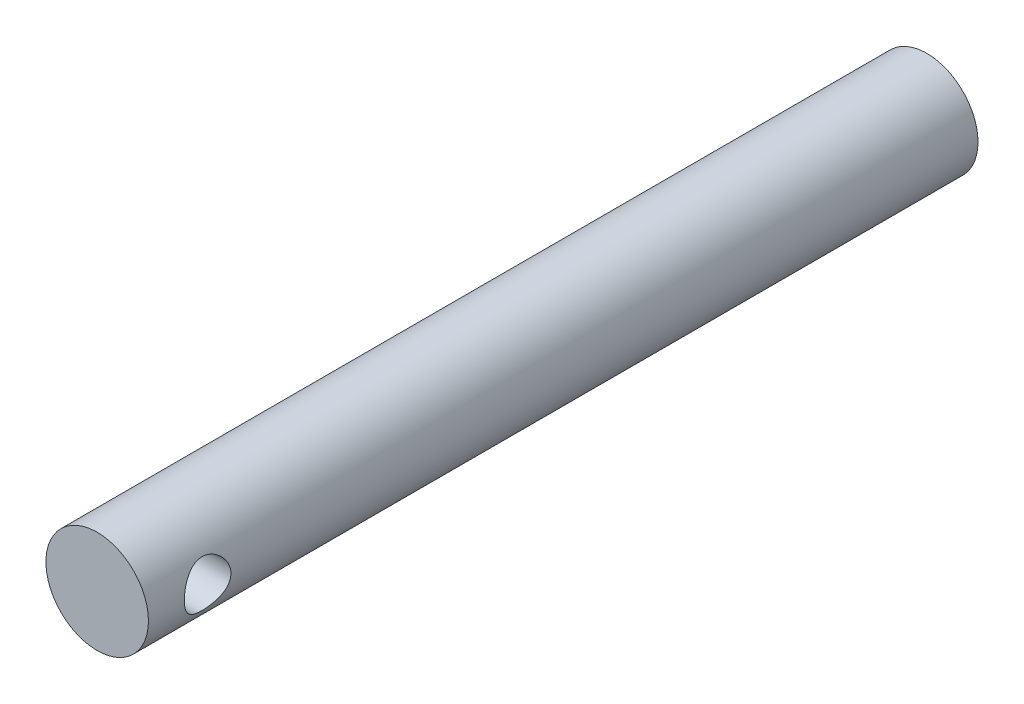
ISO-10303-21;
HEADER;
FILE_DESCRIPTION(('STEP AP214'),'2;1');
FILE_NAME('part.step','',(''),(''),'','','');
FILE_SCHEMA(('AUTOMOTIVE_DESIGN { 1 0 10303 214 1 1 1 1 }'));
ENDSEC;
DATA;
#1=APPLICATION_CONTEXT('core data for automotive mechanical design processes');
#2=APPLICATION_PROTOCOL_DEFINITION('international standard','automotive_design',2000,#1);
#3=PRODUCT_CONTEXT('',#1,'mechanical');
#4=PRODUCT('Part','Part','',(#3));
#5=PRODUCT_RELATED_PRODUCT_CATEGORY('part','',(#4));
#6=PRODUCT_DEFINITION_FORMATION('','',#4);
#7=PRODUCT_DEFINITION_CONTEXT('part definition',#1,'design');
#8=PRODUCT_DEFINITION('design','',#6,#7);
#9=PRODUCT_DEFINITION_SHAPE('','',#8);
#10=(LENGTH_UNIT() NAMED_UNIT(*) SI_UNIT(.MILLI.,.METRE.));
#11=(NAMED_UNIT(*) PLANE_ANGLE_UNIT() SI_UNIT($,.RADIAN.));
#12=(NAMED_UNIT(*) SI_UNIT($,.STERADIAN.) SOLID_ANGLE_UNIT());
#13=UNCERTAINTY_MEASURE_WITH_UNIT(LENGTH_MEASURE(1.E-05),#10,'distance_accuracy_value','');
#14=(GEOMETRIC_REPRESENTATION_CONTEXT(3) GLOBAL_UNCERTAINTY_ASSIGNED_CONTEXT((#13)) GLOBAL_UNIT_ASSIGNED_CONTEXT((#10,
#11,#12)) REPRESENTATION_CONTEXT('',''));
#15=CARTESIAN_POINT('',(0.,0.,0.));
#16=DIRECTION('',(0.,0.,1.));
#17=DIRECTION('',(1.,0.,0.));
#18=AXIS2_PLACEMENT_3D('',#15,#16,#17);
#19=CARTESIAN_POINT('',(0.,0.,-89.));
#20=DIRECTION('',(0.,0.,-1.));
#21=DIRECTION('',(-1.,0.,0.));
#22=AXIS2_PLACEMENT_3D('',#19,#20,#21);
#23=PLANE('',#22);
#24=CARTESIAN_POINT('',(0.,0.,-89.));
#25=DIRECTION('',(0.,0.,-1.));
#26=DIRECTION('',(-1.,0.,0.));
#27=AXIS2_PLACEMENT_3D('',#24,#25,#26);
#28=CIRCLE('',#27,2.44549999999999);
#29=CARTESIAN_POINT('',(-2.44549999999999,0.,-89.));
#30=VERTEX_POINT('',#29);
#31=EDGE_CURVE('E62',#30,#30,#28,.T.);
#32=ORIENTED_EDGE('',*,*,#31,.F.);
#33=EDGE_LOOP('',(#32));
#34=FACE_BOUND('',#33,.T.);
#35=CARTESIAN_POINT('',(0.,0.,-89.));
#36=DIRECTION('',(0.,0.,1.));
#37=DIRECTION('',(1.,0.,0.));
#38=AXIS2_PLACEMENT_3D('',#35,#36,#37);
#39=CIRCLE('',#38,5.5);
#40=CARTESIAN_POINT('',(5.5,0.,-89.));
#41=VERTEX_POINT('',#40);
#42=EDGE_CURVE('E11',#41,#41,#39,.T.);
#43=ORIENTED_EDGE('',*,*,#42,.F.);
#44=EDGE_LOOP('',(#43));
#45=FACE_BOUND('',#44,.T.);
#46=ADVANCED_FACE('F37',(#34,#45),#23,.T.);
#47=CARTESIAN_POINT('',(0.,0.,0.));
#48=DIRECTION('',(0.,0.,1.));
#49=DIRECTION('',(1.,0.,0.));
#50=AXIS2_PLACEMENT_3D('',#47,#48,#49);
#51=CYLINDRICAL_SURFACE('',#50,5.5);
#52=CARTESIAN_POINT('',(5.5,0.,-8.85));
#53=CARTESIAN_POINT('',(5.49999369870931,0.132816145284357,-8.84999229342032));
#54=CARTESIAN_POINT('',(5.49513526114601,0.265835701448803,-8.83935291148528));
#55=CARTESIAN_POINT('',(5.47618102046917,0.528027896062537,-8.79722291414957));
#56=CARTESIAN_POINT('',(5.46206378775658,0.657190881556424,-8.76568392457899));
#57=CARTESIAN_POINT('',(5.42608787981103,0.907466739557299,-8.68319455284778));
#58=CARTESIAN_POINT('',(5.40425732698846,1.02860698228922,-8.63231463636596));
#59=CARTESIAN_POINT('',(5.35492606344154,1.26049169700434,-8.51291058064466));
#60=CARTESIAN_POINT('',(5.32742648991282,1.37123824747009,-8.44438997941068));
#61=CARTESIAN_POINT('',(5.26767788661504,1.58575279564469,-8.28751407526684));
#62=CARTESIAN_POINT('',(5.23525516065229,1.68884771841108,-8.19830532239209));
#63=CARTESIAN_POINT('',(5.169981608249,1.87921167122033,-8.00440108987697));
#64=CARTESIAN_POINT('',(5.1371305283963,1.96647083094001,-7.89969602479297));
#65=CARTESIAN_POINT('',(5.07244492450594,2.12798843737884,-7.6700550578719));
#66=CARTESIAN_POINT('',(5.040794979573,2.20112759491811,-7.54427419294911));
#67=CARTESIAN_POINT('',(4.98491966737432,2.32491325493927,-7.28056798081201));
#68=CARTESIAN_POINT('',(4.96068978306032,2.37557345021863,-7.14265008825662));
#69=CARTESIAN_POINT('',(4.9243140427224,2.45005627758752,-6.86630451436695));
#70=CARTESIAN_POINT('',(4.91158514421169,2.47518302941619,-6.72830841926503));
#71=CARTESIAN_POINT('',(4.89801821463239,2.50193279260797,-6.44951805458402));
#72=CARTESIAN_POINT('',(4.89717166555205,2.50357264087074,-6.30872586193638));
#73=CARTESIAN_POINT('',(4.90698153027191,2.48427141198996,-6.04258927973666));
#74=CARTESIAN_POINT('',(4.91655818122591,2.46545016283118,-5.91704267044116));
#75=CARTESIAN_POINT('',(4.94428109958009,2.4093676508794,-5.6711339234907));
#76=CARTESIAN_POINT('',(4.96242941226084,2.37210198697065,-5.55077303068094));
#77=CARTESIAN_POINT('',(5.00567208218791,2.27945184779561,-5.31536342011179));
#78=CARTESIAN_POINT('',(5.03091516285485,2.22367420519436,-5.20049801398919));
#79=CARTESIAN_POINT('',(5.08548488907163,2.09586859273949,-4.9812585447318));
#80=CARTESIAN_POINT('',(5.11481328424216,2.02383365211919,-4.87688900982492));
#81=CARTESIAN_POINT('',(5.17789221587211,1.85692478057703,-4.67035343477603));
#82=CARTESIAN_POINT('',(5.2117880598316,1.76046753299936,-4.56950726646535));
#83=CARTESIAN_POINT('',(5.27769368397502,1.55174815249175,-4.38493172671319));
#84=CARTESIAN_POINT('',(5.30970283886444,1.43948082103431,-4.30120800761349));
#85=CARTESIAN_POINT('',(5.36950534618767,1.19766281925566,-4.15079331604037));
#86=CARTESIAN_POINT('',(5.39712978524095,1.06767206685173,-4.08473752097628));
#87=CARTESIAN_POINT('',(5.44369936052484,0.796844896081458,-3.97591160412101));
#88=CARTESIAN_POINT('',(5.46265022004357,0.656015701378205,-3.93312612382021));
#89=CARTESIAN_POINT('',(5.48860490400603,0.378449914355491,-3.87504463063654));
#90=CARTESIAN_POINT('',(5.49637394767751,0.242154484202897,-3.85798360079138));
#91=CARTESIAN_POINT('',(5.50161007334277,-0.0315660436282497,-3.84645311553908));
#92=CARTESIAN_POINT('',(5.49908087348691,-0.168990715716222,-3.85197550645783));
#93=CARTESIAN_POINT('',(5.48448407938737,-0.432146778493068,-3.8842858090429));
#94=CARTESIAN_POINT('',(5.47301153257062,-0.558078127396234,-3.90974752153944));
#95=CARTESIAN_POINT('',(5.44237110560927,-0.803693463481534,-3.97926732612561));
#96=CARTESIAN_POINT('',(5.42320230560714,-0.923376701955516,-4.02332764115579));
#97=CARTESIAN_POINT('',(5.37821815950354,-1.15732747516372,-4.13016974808212));
#98=CARTESIAN_POINT('',(5.35221506502489,-1.27131180951637,-4.19348993487643));
#99=CARTESIAN_POINT('',(5.29622400098564,-1.48744614928835,-4.336467554666));
#100=CARTESIAN_POINT('',(5.26623428600456,-1.58959093424205,-4.41613215191308));
#101=CARTESIAN_POINT('',(5.2023213866395,-1.78819128612951,-4.59731065312498));
#102=CARTESIAN_POINT('',(5.16827928194194,-1.88345063650186,-4.70009689074964));
#103=CARTESIAN_POINT('',(5.10218027178943,-2.05579555974773,-4.92056236624014));
#104=CARTESIAN_POINT('',(5.0701241805496,-2.13287371467411,-5.03824765294476));
#105=CARTESIAN_POINT('',(5.01093675854132,-2.26851417742739,-5.28945416883373));
#106=CARTESIAN_POINT('',(4.98396428661225,-2.32651178086012,-5.42332074420197));
#107=CARTESIAN_POINT('',(4.93995555801825,-2.41857144488097,-5.7005494134242));
#108=CARTESIAN_POINT('',(4.9229090037493,-2.45265831910444,-5.84390149396125));
#109=CARTESIAN_POINT('',(4.90246200756536,-2.49325807507769,-6.1225626196746));
#110=CARTESIAN_POINT('',(4.89799994349808,-2.5019188531559,-6.25748092260223));
#111=CARTESIAN_POINT('',(4.90032179261342,-2.49737021161822,-6.52683309147012));
#112=CARTESIAN_POINT('',(4.90710299172004,-2.48416607010204,-6.66126706647474));
#113=CARTESIAN_POINT('',(4.93010341873286,-2.4381684933062,-6.91662629613718));
#114=CARTESIAN_POINT('',(4.94567287009983,-2.40671995185148,-7.03785861875671));
#115=CARTESIAN_POINT('',(4.98386936157558,-2.32658661605856,-7.27329281427026));
#116=CARTESIAN_POINT('',(5.00649846696795,-2.2778967772596,-7.38749261809755));
#117=CARTESIAN_POINT('',(5.05808484439917,-2.1610419547488,-7.61378703902916));
#118=CARTESIAN_POINT('',(5.08735847849273,-2.09181431853015,-7.72525911710264));
#119=CARTESIAN_POINT('',(5.14822130854099,-1.93719380028804,-7.93566870927953));
#120=CARTESIAN_POINT('',(5.17981152212113,-1.85179378769227,-8.03460066206682));
#121=CARTESIAN_POINT('',(5.2452790147138,-1.65784520472974,-8.22666020133492));
#122=CARTESIAN_POINT('',(5.27909503785502,-1.54788097332246,-8.31838740557055));
#123=CARTESIAN_POINT('',(5.34236067072088,-1.31300676588176,-8.48226148922651));
#124=CARTESIAN_POINT('',(5.3718082548044,-1.18808990453652,-8.55439929785909));
#125=CARTESIAN_POINT('',(5.42285296457391,-0.927398695048436,-8.67602129024487));
#126=CARTESIAN_POINT('',(5.44451694348196,-0.791729654695489,-8.72569938422851));
#127=CARTESIAN_POINT('',(5.46948623676269,-0.582817222347261,-8.78218917460513));
#128=CARTESIAN_POINT('',(5.4765522405717,-0.512336727590823,-8.79800908580379));
#129=CARTESIAN_POINT('',(5.48799750884364,-0.370074071775207,-8.82351011048197));
#130=CARTESIAN_POINT('',(5.49237860050235,-0.298292830256238,-8.83319539898146));
#131=CARTESIAN_POINT('',(5.49689395714262,-0.18861229497853,-8.84316086315263));
#132=CARTESIAN_POINT('',(5.49805724033138,-0.150946407387661,-8.84572386090411));
#133=CARTESIAN_POINT('',(5.49961116371431,-0.0755258311084195,-8.84914453829042));
#134=CARTESIAN_POINT('',(5.50000179200307,-0.0377711410607123,-8.85000219164852));
#135=CARTESIAN_POINT('',(5.5,0.,-8.85));
#136=B_SPLINE_CURVE_WITH_KNOTS('',3,(#52,#53,#54,#55,#56,#57,#58,#59,#60,#61,#62,#63,#64,#65,
#66,#67,#68,#69,#70,#71,#72,#73,#74,#75,#76,#77,#78,#79,#80,#81,#82,#83,#84,#85,#86,#87,#88,#89,
#90,#91,#92,#93,#94,#95,#96,#97,#98,#99,#100,#101,#102,#103,#104,#105,#106,#107,#108,#109,#110,
#111,#112,#113,#114,#115,#116,#117,#118,#119,#120,#121,#122,#123,#124,#125,#126,#127,#128,#129,
#130,#131,#132,#133,#134,#135),.UNSPECIFIED.,.T.,.F.,(4,2,2,2,2,2,2,2,2,2,2,2,2,2,2,2,2,2,2,2,2,
2,2,2,2,2,2,2,2,2,2,2,2,2,2,2,2,2,2,2,2,4),(0.,0.398300931001202,0.797527003400662,
1.19531228574912,1.59301785057736,2.01163405819865,2.43051029696777,2.8749655137827,
3.31914962297436,3.73929338084823,4.15913593798615,4.53929253779887,4.91953989247825,
5.30844370198958,5.6975145826618,6.1264236824533,6.55547414294634,6.99833839939004,
7.44091000768856,7.85145915894037,8.26186009578162,8.64706845596611,9.03232287003283,
9.42952911220837,9.8269098353609,10.2576285831247,10.6885227618009,11.1312140224167,
11.5734451926766,11.9770599127743,12.3805772161773,12.7575667492601,13.1346666732434,
13.5363493613727,13.9382095697602,14.3775242869152,14.8170420813821,15.2526891454276,
15.4701654657451,15.6874936194379,15.800763348909,15.9140348236778),.UNSPECIFIED.);
#137=CARTESIAN_POINT('',(5.5,0.,-8.85));
#138=VERTEX_POINT('',#137);
#139=EDGE_CURVE('E40',#138,#138,#136,.T.);
#140=ORIENTED_EDGE('',*,*,#139,.F.);
#141=EDGE_LOOP('',(#140));
#142=FACE_BOUND('',#141,.T.);
#143=CARTESIAN_POINT('',(-5.5,0.,-8.85));
#144=CARTESIAN_POINT('',(-5.49999369870931,-0.132816145284357,-8.84999229342032));
#145=CARTESIAN_POINT('',(-5.49513526114601,-0.265835701448803,-8.83935291148528));
#146=CARTESIAN_POINT('',(-5.47618102046917,-0.528027896062537,-8.79722291414957));
#147=CARTESIAN_POINT('',(-5.46206378775658,-0.657190881556424,-8.76568392457899));
#148=CARTESIAN_POINT('',(-5.42608787981103,-0.907466739557299,-8.68319455284778));
#149=CARTESIAN_POINT('',(-5.40425732698846,-1.02860698228922,-8.63231463636596));
#150=CARTESIAN_POINT('',(-5.35492606344154,-1.26049169700434,-8.51291058064466));
#151=CARTESIAN_POINT('',(-5.32742648991282,-1.37123824747009,-8.44438997941068));
#152=CARTESIAN_POINT('',(-5.26767788661504,-1.58575279564469,-8.28751407526684));
#153=CARTESIAN_POINT('',(-5.23525516065229,-1.68884771841108,-8.19830532239209));
#154=CARTESIAN_POINT('',(-5.169981608249,-1.87921167122033,-8.00440108987697));
#155=CARTESIAN_POINT('',(-5.1371305283963,-1.96647083094001,-7.89969602479297));
#156=CARTESIAN_POINT('',(-5.07244492450594,-2.12798843737884,-7.6700550578719));
#157=CARTESIAN_POINT('',(-5.040794979573,-2.20112759491811,-7.54427419294911));
#158=CARTESIAN_POINT('',(-4.98491966737432,-2.32491325493927,-7.28056798081201));
#159=CARTESIAN_POINT('',(-4.96068978306032,-2.37557345021863,-7.14265008825662));
#160=CARTESIAN_POINT('',(-4.9243140427224,-2.45005627758752,-6.86630451436695));
#161=CARTESIAN_POINT('',(-4.91158514421169,-2.47518302941619,-6.72830841926503));
#162=CARTESIAN_POINT('',(-4.89801821463239,-2.50193279260797,-6.44951805458402));
#163=CARTESIAN_POINT('',(-4.89717166555205,-2.50357264087074,-6.30872586193638));
#164=CARTESIAN_POINT('',(-4.90698153027191,-2.48427141198996,-6.04258927973666));
#165=CARTESIAN_POINT('',(-4.91655818122591,-2.46545016283118,-5.91704267044116));
#166=CARTESIAN_POINT('',(-4.94428109958009,-2.4093676508794,-5.6711339234907));
#167=CARTESIAN_POINT('',(-4.96242941226084,-2.37210198697065,-5.55077303068094));
#168=CARTESIAN_POINT('',(-5.00567208218791,-2.27945184779561,-5.31536342011179));
#169=CARTESIAN_POINT('',(-5.03091516285485,-2.22367420519436,-5.20049801398919));
#170=CARTESIAN_POINT('',(-5.08548488907163,-2.09586859273949,-4.9812585447318));
#171=CARTESIAN_POINT('',(-5.11481328424216,-2.02383365211919,-4.87688900982492));
#172=CARTESIAN_POINT('',(-5.17789221587211,-1.85692478057703,-4.67035343477603));
#173=CARTESIAN_POINT('',(-5.2117880598316,-1.76046753299936,-4.56950726646535));
#174=CARTESIAN_POINT('',(-5.27769368397502,-1.55174815249175,-4.38493172671319));
#175=CARTESIAN_POINT('',(-5.30970283886444,-1.43948082103431,-4.30120800761349));
#176=CARTESIAN_POINT('',(-5.36950534618767,-1.19766281925566,-4.15079331604037));
#177=CARTESIAN_POINT('',(-5.39712978524095,-1.06767206685173,-4.08473752097628));
#178=CARTESIAN_POINT('',(-5.44369936052484,-0.796844896081458,-3.97591160412101));
#179=CARTESIAN_POINT('',(-5.46265022004357,-0.656015701378205,-3.93312612382021));
#180=CARTESIAN_POINT('',(-5.48860490400603,-0.378449914355491,-3.87504463063654));
#181=CARTESIAN_POINT('',(-5.49637394767751,-0.242154484202897,-3.85798360079138));
#182=CARTESIAN_POINT('',(-5.50161007334277,0.0315660436282497,-3.84645311553908));
#183=CARTESIAN_POINT('',(-5.49908087348691,0.168990715716222,-3.85197550645783));
#184=CARTESIAN_POINT('',(-5.48448407938737,0.432146778493068,-3.8842858090429));
#185=CARTESIAN_POINT('',(-5.47301153257062,0.558078127396234,-3.90974752153944));
#186=CARTESIAN_POINT('',(-5.44237110560927,0.803693463481534,-3.97926732612561));
#187=CARTESIAN_POINT('',(-5.42320230560714,0.923376701955516,-4.02332764115579));
#188=CARTESIAN_POINT('',(-5.37821815950354,1.15732747516372,-4.13016974808212));
#189=CARTESIAN_POINT('',(-5.35221506502489,1.27131180951637,-4.19348993487643));
#190=CARTESIAN_POINT('',(-5.29622400098564,1.48744614928835,-4.336467554666));
#191=CARTESIAN_POINT('',(-5.26623428600456,1.58959093424205,-4.41613215191308));
#192=CARTESIAN_POINT('',(-5.2023213866395,1.78819128612951,-4.59731065312498));
#193=CARTESIAN_POINT('',(-5.16827928194194,1.88345063650186,-4.70009689074964));
#194=CARTESIAN_POINT('',(-5.10218027178943,2.05579555974773,-4.92056236624014));
#195=CARTESIAN_POINT('',(-5.0701241805496,2.13287371467411,-5.03824765294476));
#196=CARTESIAN_POINT('',(-5.01093675854132,2.26851417742739,-5.28945416883373));
#197=CARTESIAN_POINT('',(-4.98396428661225,2.32651178086012,-5.42332074420197));
#198=CARTESIAN_POINT('',(-4.93995555801825,2.41857144488097,-5.7005494134242));
#199=CARTESIAN_POINT('',(-4.9229090037493,2.45265831910444,-5.84390149396125));
#200=CARTESIAN_POINT('',(-4.90246200756536,2.49325807507769,-6.1225626196746));
#201=CARTESIAN_POINT('',(-4.89799994349808,2.5019188531559,-6.25748092260223));
#202=CARTESIAN_POINT('',(-4.90032179261342,2.49737021161822,-6.52683309147012));
#203=CARTESIAN_POINT('',(-4.90710299172004,2.48416607010204,-6.66126706647474));
#204=CARTESIAN_POINT('',(-4.93010341873286,2.4381684933062,-6.91662629613718));
#205=CARTESIAN_POINT('',(-4.94567287009983,2.40671995185148,-7.03785861875671));
#206=CARTESIAN_POINT('',(-4.98386936157558,2.32658661605856,-7.27329281427026));
#207=CARTESIAN_POINT('',(-5.00649846696795,2.2778967772596,-7.38749261809755));
#208=CARTESIAN_POINT('',(-5.05808484439917,2.1610419547488,-7.61378703902916));
#209=CARTESIAN_POINT('',(-5.08735847849273,2.09181431853015,-7.72525911710264));
#210=CARTESIAN_POINT('',(-5.14822130854099,1.93719380028804,-7.93566870927953));
#211=CARTESIAN_POINT('',(-5.17981152212113,1.85179378769227,-8.03460066206682));
#212=CARTESIAN_POINT('',(-5.2452790147138,1.65784520472974,-8.22666020133492));
#213=CARTESIAN_POINT('',(-5.27909503785502,1.54788097332246,-8.31838740557055));
#214=CARTESIAN_POINT('',(-5.34236067072088,1.31300676588176,-8.48226148922651));
#215=CARTESIAN_POINT('',(-5.3718082548044,1.18808990453652,-8.55439929785909));
#216=CARTESIAN_POINT('',(-5.42285296457391,0.927398695048436,-8.67602129024487));
#217=CARTESIAN_POINT('',(-5.44451694348196,0.791729654695489,-8.72569938422851));
#218=CARTESIAN_POINT('',(-5.46948623676269,0.582817222347261,-8.78218917460513));
#219=CARTESIAN_POINT('',(-5.4765522405717,0.512336727590823,-8.79800908580379));
#220=CARTESIAN_POINT('',(-5.48799750884364,0.370074071775207,-8.82351011048197));
#221=CARTESIAN_POINT('',(-5.49237860050235,0.298292830256238,-8.83319539898146));
#222=CARTESIAN_POINT('',(-5.49689395714262,0.18861229497853,-8.84316086315263));
#223=CARTESIAN_POINT('',(-5.49805724033138,0.150946407387661,-8.84572386090411));
#224=CARTESIAN_POINT('',(-5.49961116371431,0.0755258311084195,-8.84914453829042));
#225=CARTESIAN_POINT('',(-5.50000179200307,0.0377711410607123,-8.85000219164852));
#226=CARTESIAN_POINT('',(-5.5,0.,-8.85));
#227=B_SPLINE_CURVE_WITH_KNOTS('',3,(#143,#144,#145,#146,#147,#148,#149,#150,#151,#152,#153,
#154,#155,#156,#157,#158,#159,#160,#161,#162,#163,#164,#165,#166,#167,#168,#169,#170,#171,#172,
#173,#174,#175,#176,#177,#178,#179,#180,#181,#182,#183,#184,#185,#186,#187,#188,#189,#190,#191,
#192,#193,#194,#195,#196,#197,#198,#199,#200,#201,#202,#203,#204,#205,#206,#207,#208,#209,#210,
#211,#212,#213,#214,#215,#216,#217,#218,#219,#220,#221,#222,#223,#224,#225,#226),.UNSPECIFIED.,
.T.,.F.,(4,2,2,2,2,2,2,2,2,2,2,2,2,2,2,2,2,2,2,2,2,2,2,2,2,2,2,2,2,2,2,2,2,2,2,2,2,2,2,2,2,4),
(0.,0.398300931001202,0.797527003400662,1.19531228574912,1.59301785057736,2.01163405819865,
2.43051029696777,2.8749655137827,3.31914962297436,3.73929338084823,4.15913593798615,
4.53929253779887,4.91953989247825,5.30844370198958,5.6975145826618,6.1264236824533,
6.55547414294634,6.99833839939004,7.44091000768856,7.85145915894037,8.26186009578162,
8.64706845596611,9.03232287003283,9.42952911220837,9.8269098353609,10.2576285831247,
10.6885227618009,11.1312140224167,11.5734451926766,11.9770599127743,12.3805772161773,
12.7575667492601,13.1346666732434,13.5363493613727,13.9382095697602,14.3775242869152,
14.8170420813821,15.2526891454276,15.4701654657451,15.6874936194379,15.800763348909,
15.9140348236778),.UNSPECIFIED.);
#228=CARTESIAN_POINT('',(-5.5,0.,-8.85));
#229=VERTEX_POINT('',#228);
#230=EDGE_CURVE('E61',#229,#229,#227,.T.);
#231=ORIENTED_EDGE('',*,*,#230,.F.);
#232=EDGE_LOOP('',(#231));
#233=FACE_BOUND('',#232,.T.);
#234=ORIENTED_EDGE('',*,*,#42,.T.);
#235=EDGE_LOOP('',(#234));
#236=FACE_BOUND('',#235,.T.);
#237=CARTESIAN_POINT('',(0.,0.,0.));
#238=DIRECTION('',(0.,0.,1.));
#239=DIRECTION('',(1.,0.,0.));
#240=AXIS2_PLACEMENT_3D('',#237,#238,#239);
#241=CIRCLE('',#240,5.5);
#242=CARTESIAN_POINT('',(5.5,0.,0.));
#243=VERTEX_POINT('',#242);
#244=EDGE_CURVE('E47',#243,#243,#241,.T.);
#245=ORIENTED_EDGE('',*,*,#244,.F.);
#246=EDGE_LOOP('',(#245));
#247=FACE_BOUND('',#246,.T.);
#248=ADVANCED_FACE('F71',(#142,#233,#236,#247),#51,.T.);
#249=CARTESIAN_POINT('',(0.,0.,0.));
#250=DIRECTION('',(0.,0.,1.));
#251=DIRECTION('',(1.,0.,0.));
#252=AXIS2_PLACEMENT_3D('',#249,#250,#251);
#253=PLANE('',#252);
#254=ORIENTED_EDGE('',*,*,#244,.T.);
#255=EDGE_LOOP('',(#254));
#256=FACE_BOUND('',#255,.T.);
#257=ADVANCED_FACE('F76',(#256),#253,.T.);
#258=CARTESIAN_POINT('',(-15.,0.,-6.35));
#259=DIRECTION('',(1.,0.,0.));
#260=DIRECTION('',(0.,0.,-1.));
#261=AXIS2_PLACEMENT_3D('',#258,#259,#260);
#262=CYLINDRICAL_SURFACE('',#261,2.5);
#263=ORIENTED_EDGE('',*,*,#139,.T.);
#264=EDGE_LOOP('',(#263));
#265=FACE_BOUND('',#264,.T.);
#266=ORIENTED_EDGE('',*,*,#230,.T.);
#267=EDGE_LOOP('',(#266));
#268=FACE_BOUND('',#267,.T.);
#269=ADVANCED_FACE('F55',(#265,#268),#262,.F.);
#270=CARTESIAN_POINT('',(0.,0.,-59.));
#271=DIRECTION('',(0.,0.,-1.));
#272=DIRECTION('',(-1.,0.,0.));
#273=AXIS2_PLACEMENT_3D('',#270,#271,#272);
#274=CONICAL_SURFACE('',#273,2.44549999999999,1.02974425867665);
#275=CARTESIAN_POINT('',(0.,0.,-57.5305953561681));
#276=VERTEX_POINT('',#275);
#277=VERTEX_LOOP('',#276);
#278=FACE_BOUND('',#277,.T.);
#279=CARTESIAN_POINT('',(0.,0.,-59.));
#280=DIRECTION('',(0.,0.,-1.));
#281=DIRECTION('',(-1.,0.,0.));
#282=AXIS2_PLACEMENT_3D('',#279,#280,#281);
#283=CIRCLE('',#282,2.44549999999999);
#284=CARTESIAN_POINT('',(-2.44549999999999,0.,-59.));
#285=VERTEX_POINT('',#284);
#286=EDGE_CURVE('E59',#285,#285,#283,.T.);
#287=ORIENTED_EDGE('',*,*,#286,.T.);
#288=EDGE_LOOP('',(#287));
#289=FACE_BOUND('',#288,.T.);
#290=ADVANCED_FACE('F51',(#278,#289),#274,.F.);
#291=CARTESIAN_POINT('',(0.,0.,-89.));
#292=DIRECTION('',(0.,0.,-1.));
#293=DIRECTION('',(-1.,0.,0.));
#294=AXIS2_PLACEMENT_3D('',#291,#292,#293);
#295=CYLINDRICAL_SURFACE('',#294,2.44549999999999);
#296=ORIENTED_EDGE('',*,*,#286,.F.);
#297=EDGE_LOOP('',(#296));
#298=FACE_BOUND('',#297,.T.);
#299=ORIENTED_EDGE('',*,*,#31,.T.);
#300=EDGE_LOOP('',(#299));
#301=FACE_BOUND('',#300,.T.);
#302=ADVANCED_FACE('F54',(#298,#301),#295,.F.);
#303=CLOSED_SHELL('',(#46,#248,#257,#269,#290,#302));
#304=MANIFOLD_SOLID_BREP('B2',#303);
#305=ADVANCED_BREP_SHAPE_REPRESENTATION('',(#18,#304),#14);
#306=SHAPE_DEFINITION_REPRESENTATION(#9,#305);
ENDSEC;
END-ISO-10303-21;
